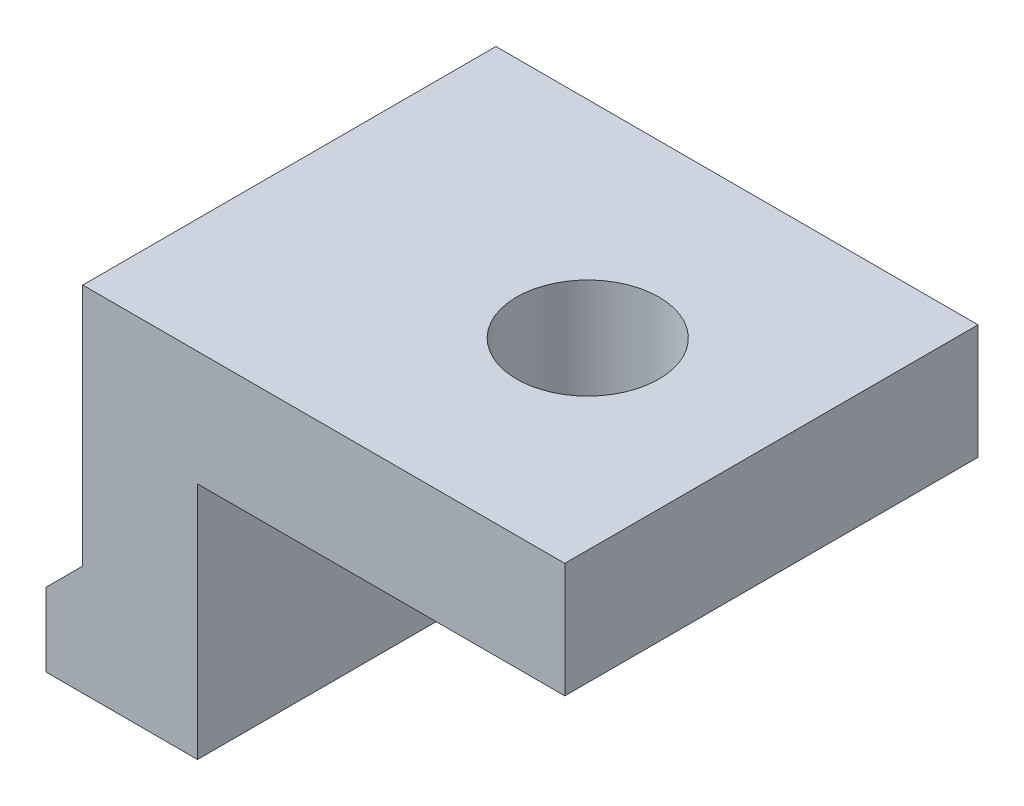
ISO-10303-21;
HEADER;
FILE_DESCRIPTION(('STEP AP214'),'2;1');
FILE_NAME('part.step','',(''),(''),'','','');
FILE_SCHEMA(('AUTOMOTIVE_DESIGN { 1 0 10303 214 1 1 1 1 }'));
ENDSEC;
DATA;
#1=APPLICATION_CONTEXT('core data for automotive mechanical design processes');
#2=APPLICATION_PROTOCOL_DEFINITION('international standard','automotive_design',2000,#1);
#3=PRODUCT_CONTEXT('',#1,'mechanical');
#4=PRODUCT('Part','Part','',(#3));
#5=PRODUCT_RELATED_PRODUCT_CATEGORY('part','',(#4));
#6=PRODUCT_DEFINITION_FORMATION('','',#4);
#7=PRODUCT_DEFINITION_CONTEXT('part definition',#1,'design');
#8=PRODUCT_DEFINITION('design','',#6,#7);
#9=PRODUCT_DEFINITION_SHAPE('','',#8);
#10=(LENGTH_UNIT() NAMED_UNIT(*) SI_UNIT(.MILLI.,.METRE.));
#11=(NAMED_UNIT(*) PLANE_ANGLE_UNIT() SI_UNIT($,.RADIAN.));
#12=(NAMED_UNIT(*) SI_UNIT($,.STERADIAN.) SOLID_ANGLE_UNIT());
#13=UNCERTAINTY_MEASURE_WITH_UNIT(LENGTH_MEASURE(1.E-05),#10,'distance_accuracy_value','');
#14=(GEOMETRIC_REPRESENTATION_CONTEXT(3) GLOBAL_UNCERTAINTY_ASSIGNED_CONTEXT((#13)) GLOBAL_UNIT_ASSIGNED_CONTEXT((#10,
#11,#12)) REPRESENTATION_CONTEXT('',''));
#15=CARTESIAN_POINT('',(0.,0.,0.));
#16=DIRECTION('',(0.,0.,1.));
#17=DIRECTION('',(1.,0.,0.));
#18=AXIS2_PLACEMENT_3D('',#15,#16,#17);
#19=CARTESIAN_POINT('',(8.,0.,9.));
#20=DIRECTION('',(1.,0.,0.));
#21=DIRECTION('',(0.,0.,-1.));
#22=AXIS2_PLACEMENT_3D('',#19,#20,#21);
#23=PLANE('',#22);
#24=DIRECTION('',(0.,-1.,0.));
#25=VECTOR('',#24,1.);
#26=CARTESIAN_POINT('',(8.,0.,0.));
#27=LINE('',#26,#25);
#28=CARTESIAN_POINT('',(8.,0.,0.));
#29=VERTEX_POINT('',#28);
#30=CARTESIAN_POINT('',(8.,-2.5,0.));
#31=VERTEX_POINT('',#30);
#32=EDGE_CURVE('E127',#29,#31,#27,.T.);
#33=ORIENTED_EDGE('',*,*,#32,.F.);
#34=DIRECTION('',(0.,0.,-1.));
#35=VECTOR('',#34,1.);
#36=CARTESIAN_POINT('',(8.,0.,9.));
#37=LINE('',#36,#35);
#38=CARTESIAN_POINT('',(8.,0.,9.));
#39=VERTEX_POINT('',#38);
#40=EDGE_CURVE('E11',#39,#29,#37,.T.);
#41=ORIENTED_EDGE('',*,*,#40,.F.);
#42=DIRECTION('',(0.,-1.,0.));
#43=VECTOR('',#42,1.);
#44=CARTESIAN_POINT('',(8.,0.,9.));
#45=LINE('',#44,#43);
#46=CARTESIAN_POINT('',(8.,-2.5,9.));
#47=VERTEX_POINT('',#46);
#48=EDGE_CURVE('E144',#39,#47,#45,.T.);
#49=ORIENTED_EDGE('',*,*,#48,.T.);
#50=DIRECTION('',(0.,0.,-1.));
#51=VECTOR('',#50,1.);
#52=CARTESIAN_POINT('',(8.,-2.5,9.));
#53=LINE('',#52,#51);
#54=EDGE_CURVE('E86',#47,#31,#53,.T.);
#55=ORIENTED_EDGE('',*,*,#54,.T.);
#56=EDGE_LOOP('',(#33,#41,#49,#55));
#57=FACE_BOUND('',#56,.T.);
#58=ADVANCED_FACE('F35',(#57),#23,.T.);
#59=CARTESIAN_POINT('',(0.,0.,9.));
#60=DIRECTION('',(0.,1.,0.));
#61=DIRECTION('',(0.,0.,1.));
#62=AXIS2_PLACEMENT_3D('',#59,#60,#61);
#63=PLANE('',#62);
#64=CARTESIAN_POINT('',(4.,0.,4.5));
#65=DIRECTION('',(0.,-1.,0.));
#66=DIRECTION('',(0.,0.,-1.));
#67=AXIS2_PLACEMENT_3D('',#64,#65,#66);
#68=CIRCLE('',#67,1.55);
#69=CARTESIAN_POINT('',(4.,0.,2.95));
#70=VERTEX_POINT('',#69);
#71=EDGE_CURVE('E131',#70,#70,#68,.T.);
#72=ORIENTED_EDGE('',*,*,#71,.T.);
#73=EDGE_LOOP('',(#72));
#74=FACE_BOUND('',#73,.T.);
#75=DIRECTION('',(1.,0.,0.));
#76=VECTOR('',#75,1.);
#77=CARTESIAN_POINT('',(0.,0.,0.));
#78=LINE('',#77,#76);
#79=CARTESIAN_POINT('',(-2.5,0.,0.));
#80=VERTEX_POINT('',#79);
#81=EDGE_CURVE('E130',#80,#29,#78,.T.);
#82=ORIENTED_EDGE('',*,*,#81,.F.);
#83=DIRECTION('',(0.,0.,-1.));
#84=VECTOR('',#83,1.);
#85=CARTESIAN_POINT('',(-2.5,0.,9.));
#86=LINE('',#85,#84);
#87=CARTESIAN_POINT('',(-2.5,0.,9.));
#88=VERTEX_POINT('',#87);
#89=EDGE_CURVE('E43',#88,#80,#86,.T.);
#90=ORIENTED_EDGE('',*,*,#89,.F.);
#91=DIRECTION('',(1.,0.,0.));
#92=VECTOR('',#91,1.);
#93=CARTESIAN_POINT('',(0.,0.,9.));
#94=LINE('',#93,#92);
#95=EDGE_CURVE('E168',#88,#39,#94,.T.);
#96=ORIENTED_EDGE('',*,*,#95,.T.);
#97=ORIENTED_EDGE('',*,*,#40,.T.);
#98=EDGE_LOOP('',(#82,#90,#96,#97));
#99=FACE_BOUND('',#98,.T.);
#100=ADVANCED_FACE('F167',(#74,#99),#63,.T.);
#101=CARTESIAN_POINT('',(-2.5,0.,9.));
#102=DIRECTION('',(1.,0.,0.));
#103=DIRECTION('',(0.,1.,0.));
#104=AXIS2_PLACEMENT_3D('',#101,#102,#103);
#105=PLANE('',#104);
#106=DIRECTION('',(0.,-1.,0.));
#107=VECTOR('',#106,1.);
#108=CARTESIAN_POINT('',(-2.5,0.,0.));
#109=LINE('',#108,#107);
#110=CARTESIAN_POINT('',(-2.5,-5.3,0.));
#111=VERTEX_POINT('',#110);
#112=EDGE_CURVE('E134',#80,#111,#109,.T.);
#113=ORIENTED_EDGE('',*,*,#112,.T.);
#114=DIRECTION('',(0.,0.,-1.));
#115=VECTOR('',#114,1.);
#116=CARTESIAN_POINT('',(-2.5,-5.3,9.));
#117=LINE('',#116,#115);
#118=CARTESIAN_POINT('',(-2.5,-5.3,9.));
#119=VERTEX_POINT('',#118);
#120=EDGE_CURVE('E151',#119,#111,#117,.T.);
#121=ORIENTED_EDGE('',*,*,#120,.F.);
#122=DIRECTION('',(0.,-1.,0.));
#123=VECTOR('',#122,1.);
#124=CARTESIAN_POINT('',(-2.5,0.,9.));
#125=LINE('',#124,#123);
#126=EDGE_CURVE('E158',#88,#119,#125,.T.);
#127=ORIENTED_EDGE('',*,*,#126,.F.);
#128=ORIENTED_EDGE('',*,*,#89,.T.);
#129=EDGE_LOOP('',(#113,#121,#127,#128));
#130=FACE_BOUND('',#129,.T.);
#131=ADVANCED_FACE('F156',(#130),#105,.F.);
#132=CARTESIAN_POINT('',(1.4,-1.40000000000001,9.));
#133=DIRECTION('',(0.707106781186547,-0.707106781186548,0.));
#134=DIRECTION('',(0.707106781186548,0.707106781186547,0.));
#135=AXIS2_PLACEMENT_3D('',#132,#133,#134);
#136=PLANE('',#135);
#137=DIRECTION('',(-0.707106781186548,-0.707106781186547,0.));
#138=VECTOR('',#137,1.);
#139=CARTESIAN_POINT('',(1.4,-1.40000000000001,0.));
#140=LINE('',#139,#138);
#141=CARTESIAN_POINT('',(-3.3,-6.1,0.));
#142=VERTEX_POINT('',#141);
#143=EDGE_CURVE('E136',#111,#142,#140,.T.);
#144=ORIENTED_EDGE('',*,*,#143,.T.);
#145=DIRECTION('',(0.,0.,-1.));
#146=VECTOR('',#145,1.);
#147=CARTESIAN_POINT('',(-3.3,-6.1,9.));
#148=LINE('',#147,#146);
#149=CARTESIAN_POINT('',(-3.3,-6.1,9.));
#150=VERTEX_POINT('',#149);
#151=EDGE_CURVE('E148',#150,#142,#148,.T.);
#152=ORIENTED_EDGE('',*,*,#151,.F.);
#153=DIRECTION('',(-0.707106781186548,-0.707106781186547,0.));
#154=VECTOR('',#153,1.);
#155=CARTESIAN_POINT('',(1.4,-1.40000000000001,9.));
#156=LINE('',#155,#154);
#157=EDGE_CURVE('E179',#119,#150,#156,.T.);
#158=ORIENTED_EDGE('',*,*,#157,.F.);
#159=ORIENTED_EDGE('',*,*,#120,.T.);
#160=EDGE_LOOP('',(#144,#152,#158,#159));
#161=FACE_BOUND('',#160,.T.);
#162=ADVANCED_FACE('F183',(#161),#136,.F.);
#163=CARTESIAN_POINT('',(-3.3,0.,9.));
#164=DIRECTION('',(1.,0.,0.));
#165=DIRECTION('',(0.,0.,-1.));
#166=AXIS2_PLACEMENT_3D('',#163,#164,#165);
#167=PLANE('',#166);
#168=DIRECTION('',(0.,-1.,0.));
#169=VECTOR('',#168,1.);
#170=CARTESIAN_POINT('',(-3.3,0.,0.));
#171=LINE('',#170,#169);
#172=CARTESIAN_POINT('',(-3.3,-7.7,0.));
#173=VERTEX_POINT('',#172);
#174=EDGE_CURVE('E138',#142,#173,#171,.T.);
#175=ORIENTED_EDGE('',*,*,#174,.T.);
#176=DIRECTION('',(0.,0.,-1.));
#177=VECTOR('',#176,1.);
#178=CARTESIAN_POINT('',(-3.3,-7.7,9.));
#179=LINE('',#178,#177);
#180=CARTESIAN_POINT('',(-3.3,-7.7,9.));
#181=VERTEX_POINT('',#180);
#182=EDGE_CURVE('E119',#181,#173,#179,.T.);
#183=ORIENTED_EDGE('',*,*,#182,.F.);
#184=DIRECTION('',(0.,-1.,0.));
#185=VECTOR('',#184,1.);
#186=CARTESIAN_POINT('',(-3.3,0.,9.));
#187=LINE('',#186,#185);
#188=EDGE_CURVE('E110',#150,#181,#187,.T.);
#189=ORIENTED_EDGE('',*,*,#188,.F.);
#190=ORIENTED_EDGE('',*,*,#151,.T.);
#191=EDGE_LOOP('',(#175,#183,#189,#190));
#192=FACE_BOUND('',#191,.T.);
#193=ADVANCED_FACE('F185',(#192),#167,.F.);
#194=CARTESIAN_POINT('',(0.,-7.7,9.));
#195=DIRECTION('',(0.,1.,0.));
#196=DIRECTION('',(0.,0.,1.));
#197=AXIS2_PLACEMENT_3D('',#194,#195,#196);
#198=PLANE('',#197);
#199=DIRECTION('',(1.,0.,0.));
#200=VECTOR('',#199,1.);
#201=CARTESIAN_POINT('',(0.,-7.7,0.));
#202=LINE('',#201,#200);
#203=CARTESIAN_POINT('',(0.,-7.7,0.));
#204=VERTEX_POINT('',#203);
#205=EDGE_CURVE('E118',#173,#204,#202,.T.);
#206=ORIENTED_EDGE('',*,*,#205,.T.);
#207=DIRECTION('',(0.,0.,-1.));
#208=VECTOR('',#207,1.);
#209=CARTESIAN_POINT('',(0.,-7.7,9.));
#210=LINE('',#209,#208);
#211=CARTESIAN_POINT('',(0.,-7.7,9.));
#212=VERTEX_POINT('',#211);
#213=EDGE_CURVE('E115',#212,#204,#210,.T.);
#214=ORIENTED_EDGE('',*,*,#213,.F.);
#215=DIRECTION('',(1.,0.,0.));
#216=VECTOR('',#215,1.);
#217=CARTESIAN_POINT('',(0.,-7.7,9.));
#218=LINE('',#217,#216);
#219=EDGE_CURVE('E104',#181,#212,#218,.T.);
#220=ORIENTED_EDGE('',*,*,#219,.F.);
#221=ORIENTED_EDGE('',*,*,#182,.T.);
#222=EDGE_LOOP('',(#206,#214,#220,#221));
#223=FACE_BOUND('',#222,.T.);
#224=ADVANCED_FACE('F116',(#223),#198,.F.);
#225=CARTESIAN_POINT('',(0.,0.,9.));
#226=DIRECTION('',(-1.,0.,0.));
#227=DIRECTION('',(0.,0.,1.));
#228=AXIS2_PLACEMENT_3D('',#225,#226,#227);
#229=PLANE('',#228);
#230=DIRECTION('',(0.,1.,0.));
#231=VECTOR('',#230,1.);
#232=CARTESIAN_POINT('',(0.,0.,0.));
#233=LINE('',#232,#231);
#234=CARTESIAN_POINT('',(0.,-2.5,0.));
#235=VERTEX_POINT('',#234);
#236=EDGE_CURVE('E79',#204,#235,#233,.T.);
#237=ORIENTED_EDGE('',*,*,#236,.T.);
#238=DIRECTION('',(0.,0.,-1.));
#239=VECTOR('',#238,1.);
#240=CARTESIAN_POINT('',(0.,-2.5,9.));
#241=LINE('',#240,#239);
#242=CARTESIAN_POINT('',(0.,-2.5,9.));
#243=VERTEX_POINT('',#242);
#244=EDGE_CURVE('E120',#243,#235,#241,.T.);
#245=ORIENTED_EDGE('',*,*,#244,.F.);
#246=DIRECTION('',(0.,1.,0.));
#247=VECTOR('',#246,1.);
#248=CARTESIAN_POINT('',(0.,0.,9.));
#249=LINE('',#248,#247);
#250=EDGE_CURVE('E108',#212,#243,#249,.T.);
#251=ORIENTED_EDGE('',*,*,#250,.F.);
#252=ORIENTED_EDGE('',*,*,#213,.T.);
#253=EDGE_LOOP('',(#237,#245,#251,#252));
#254=FACE_BOUND('',#253,.T.);
#255=ADVANCED_FACE('F122',(#254),#229,.F.);
#256=CARTESIAN_POINT('',(0.,-2.5,9.));
#257=DIRECTION('',(0.,1.,0.));
#258=DIRECTION('',(0.,0.,1.));
#259=AXIS2_PLACEMENT_3D('',#256,#257,#258);
#260=PLANE('',#259);
#261=CARTESIAN_POINT('',(4.,-2.5,4.5));
#262=DIRECTION('',(0.,-1.,0.));
#263=DIRECTION('',(0.,0.,-1.));
#264=AXIS2_PLACEMENT_3D('',#261,#262,#263);
#265=CIRCLE('',#264,1.55);
#266=CARTESIAN_POINT('',(4.,-2.5,2.95));
#267=VERTEX_POINT('',#266);
#268=EDGE_CURVE('E175',#267,#267,#265,.T.);
#269=ORIENTED_EDGE('',*,*,#268,.F.);
#270=EDGE_LOOP('',(#269));
#271=FACE_BOUND('',#270,.T.);
#272=DIRECTION('',(1.,0.,0.));
#273=VECTOR('',#272,1.);
#274=CARTESIAN_POINT('',(0.,-2.5,0.));
#275=LINE('',#274,#273);
#276=EDGE_CURVE('E142',#235,#31,#275,.T.);
#277=ORIENTED_EDGE('',*,*,#276,.T.);
#278=ORIENTED_EDGE('',*,*,#54,.F.);
#279=DIRECTION('',(1.,0.,0.));
#280=VECTOR('',#279,1.);
#281=CARTESIAN_POINT('',(0.,-2.5,9.));
#282=LINE('',#281,#280);
#283=EDGE_CURVE('E51',#243,#47,#282,.T.);
#284=ORIENTED_EDGE('',*,*,#283,.F.);
#285=ORIENTED_EDGE('',*,*,#244,.T.);
#286=EDGE_LOOP('',(#277,#278,#284,#285));
#287=FACE_BOUND('',#286,.T.);
#288=ADVANCED_FACE('F171',(#271,#287),#260,.F.);
#289=CARTESIAN_POINT('',(0.,0.,9.));
#290=DIRECTION('',(0.,0.,1.));
#291=DIRECTION('',(1.,0.,0.));
#292=AXIS2_PLACEMENT_3D('',#289,#290,#291);
#293=PLANE('',#292);
#294=ORIENTED_EDGE('',*,*,#48,.F.);
#295=ORIENTED_EDGE('',*,*,#95,.F.);
#296=ORIENTED_EDGE('',*,*,#126,.T.);
#297=ORIENTED_EDGE('',*,*,#157,.T.);
#298=ORIENTED_EDGE('',*,*,#188,.T.);
#299=ORIENTED_EDGE('',*,*,#219,.T.);
#300=ORIENTED_EDGE('',*,*,#250,.T.);
#301=ORIENTED_EDGE('',*,*,#283,.T.);
#302=EDGE_LOOP('',(#294,#295,#296,#297,#298,#299,#300,#301));
#303=FACE_BOUND('',#302,.T.);
#304=ADVANCED_FACE('F106',(#303),#293,.T.);
#305=CARTESIAN_POINT('',(0.,0.,0.));
#306=DIRECTION('',(0.,0.,1.));
#307=DIRECTION('',(1.,0.,0.));
#308=AXIS2_PLACEMENT_3D('',#305,#306,#307);
#309=PLANE('',#308);
#310=ORIENTED_EDGE('',*,*,#32,.T.);
#311=ORIENTED_EDGE('',*,*,#276,.F.);
#312=ORIENTED_EDGE('',*,*,#236,.F.);
#313=ORIENTED_EDGE('',*,*,#205,.F.);
#314=ORIENTED_EDGE('',*,*,#174,.F.);
#315=ORIENTED_EDGE('',*,*,#143,.F.);
#316=ORIENTED_EDGE('',*,*,#112,.F.);
#317=ORIENTED_EDGE('',*,*,#81,.T.);
#318=EDGE_LOOP('',(#310,#311,#312,#313,#314,#315,#316,#317));
#319=FACE_BOUND('',#318,.T.);
#320=ADVANCED_FACE('F165',(#319),#309,.F.);
#321=CARTESIAN_POINT('',(4.,0.,4.5));
#322=DIRECTION('',(0.,-1.,0.));
#323=DIRECTION('',(0.,0.,-1.));
#324=AXIS2_PLACEMENT_3D('',#321,#322,#323);
#325=CYLINDRICAL_SURFACE('',#324,1.55);
#326=ORIENTED_EDGE('',*,*,#71,.F.);
#327=EDGE_LOOP('',(#326));
#328=FACE_BOUND('',#327,.T.);
#329=ORIENTED_EDGE('',*,*,#268,.T.);
#330=EDGE_LOOP('',(#329));
#331=FACE_BOUND('',#330,.T.);
#332=ADVANCED_FACE('F209',(#328,#331),#325,.F.);
#333=CLOSED_SHELL('',(#58,#100,#131,#162,#193,#224,#255,#288,#304,#320,#332));
#334=MANIFOLD_SOLID_BREP('B2',#333);
#335=ADVANCED_BREP_SHAPE_REPRESENTATION('',(#18,#334),#14);
#336=SHAPE_DEFINITION_REPRESENTATION(#9,#335);
ENDSEC;
END-ISO-10303-21;
